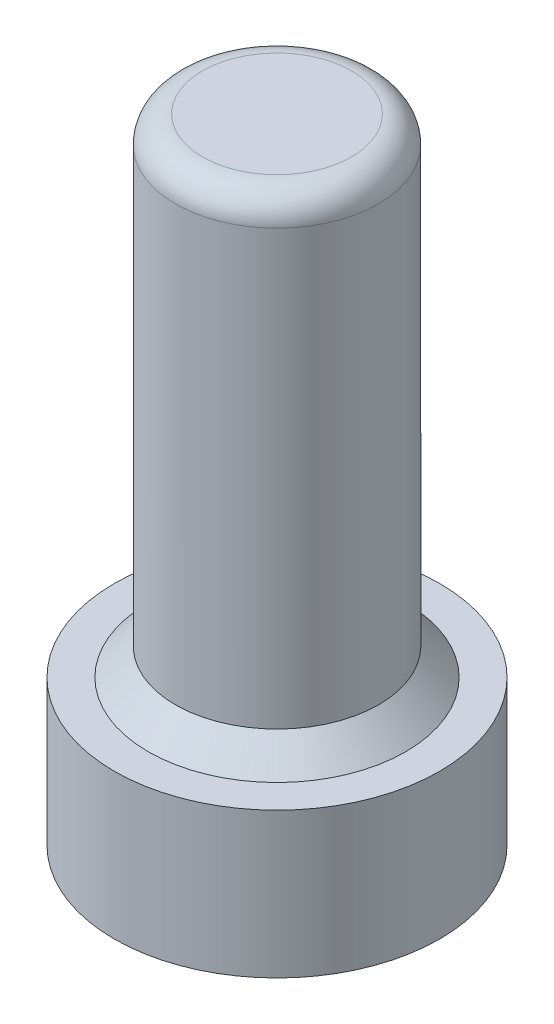
ISO-10303-21;
HEADER;
FILE_DESCRIPTION(('STEP AP214'),'2;1');
FILE_NAME('part.step','',(''),(''),'','','');
FILE_SCHEMA(('AUTOMOTIVE_DESIGN { 1 0 10303 214 1 1 1 1 }'));
ENDSEC;
DATA;
#1=APPLICATION_CONTEXT('core data for automotive mechanical design processes');
#2=APPLICATION_PROTOCOL_DEFINITION('international standard','automotive_design',2000,#1);
#3=PRODUCT_CONTEXT('',#1,'mechanical');
#4=PRODUCT('Part','Part','',(#3));
#5=PRODUCT_RELATED_PRODUCT_CATEGORY('part','',(#4));
#6=PRODUCT_DEFINITION_FORMATION('','',#4);
#7=PRODUCT_DEFINITION_CONTEXT('part definition',#1,'design');
#8=PRODUCT_DEFINITION('design','',#6,#7);
#9=PRODUCT_DEFINITION_SHAPE('','',#8);
#10=(LENGTH_UNIT() NAMED_UNIT(*) SI_UNIT(.MILLI.,.METRE.));
#11=(NAMED_UNIT(*) PLANE_ANGLE_UNIT() SI_UNIT($,.RADIAN.));
#12=(NAMED_UNIT(*) SI_UNIT($,.STERADIAN.) SOLID_ANGLE_UNIT());
#13=UNCERTAINTY_MEASURE_WITH_UNIT(LENGTH_MEASURE(1.E-05),#10,'distance_accuracy_value','');
#14=(GEOMETRIC_REPRESENTATION_CONTEXT(3) GLOBAL_UNCERTAINTY_ASSIGNED_CONTEXT((#13)) GLOBAL_UNIT_ASSIGNED_CONTEXT((#10,
#11,#12)) REPRESENTATION_CONTEXT('',''));
#15=CARTESIAN_POINT('',(0.,0.,0.));
#16=DIRECTION('',(0.,0.,1.));
#17=DIRECTION('',(1.,0.,0.));
#18=AXIS2_PLACEMENT_3D('',#15,#16,#17);
#19=CARTESIAN_POINT('',(0.,11.68,0.));
#20=DIRECTION('',(0.,1.,0.));
#21=DIRECTION('',(-1.,0.,0.));
#22=AXIS2_PLACEMENT_3D('',#19,#20,#21);
#23=PLANE('',#22);
#24=CARTESIAN_POINT('',(0.,11.68,0.));
#25=DIRECTION('',(0.,1.,0.));
#26=DIRECTION('',(-1.,0.,0.));
#27=AXIS2_PLACEMENT_3D('',#24,#25,#26);
#28=CIRCLE('',#27,1.37500000000003);
#29=CARTESIAN_POINT('',(-1.37500000000007,11.68,0.));
#30=VERTEX_POINT('',#29);
#31=EDGE_CURVE('E10',#30,#30,#28,.T.);
#32=ORIENTED_EDGE('',*,*,#31,.T.);
#33=EDGE_LOOP('',(#32));
#34=FACE_BOUND('',#33,.T.);
#35=ADVANCED_FACE('F31',(#34),#23,.T.);
#36=CARTESIAN_POINT('',(3.49148133884313E-12,-1000.,0.));
#37=DIRECTION('',(0.,-1.,0.));
#38=DIRECTION('',(1.,0.,0.));
#39=AXIS2_PLACEMENT_3D('',#36,#37,#38);
#40=CYLINDRICAL_SURFACE('',#39,1.87500000000003);
#41=CARTESIAN_POINT('',(0.,11.18,0.));
#42=DIRECTION('',(0.,1.,0.));
#43=DIRECTION('',(-1.,0.,0.));
#44=AXIS2_PLACEMENT_3D('',#41,#42,#43);
#45=CIRCLE('',#44,1.87500000000003);
#46=CARTESIAN_POINT('',(-1.87500000000007,11.18,0.));
#47=VERTEX_POINT('',#46);
#48=EDGE_CURVE('E38',#47,#47,#45,.F.);
#49=ORIENTED_EDGE('',*,*,#48,.T.);
#50=EDGE_LOOP('',(#49));
#51=FACE_BOUND('',#50,.T.);
#52=CARTESIAN_POINT('',(0.,3.17999999999996,0.));
#53=DIRECTION('',(0.,-1.,0.));
#54=DIRECTION('',(1.,0.,0.));
#55=AXIS2_PLACEMENT_3D('',#52,#53,#54);
#56=CIRCLE('',#55,1.87500000000001);
#57=CARTESIAN_POINT('',(1.875,3.17999999999997,0.));
#58=VERTEX_POINT('',#57);
#59=EDGE_CURVE('E42',#58,#58,#56,.T.);
#60=ORIENTED_EDGE('',*,*,#59,.F.);
#61=EDGE_LOOP('',(#60));
#62=FACE_BOUND('',#61,.T.);
#63=ADVANCED_FACE('F74',(#51,#62),#40,.T.);
#64=CARTESIAN_POINT('',(0.,2.68000000000002,0.));
#65=DIRECTION('',(0.,-1.,0.));
#66=DIRECTION('',(1.,0.,0.));
#67=AXIS2_PLACEMENT_3D('',#64,#65,#66);
#68=CONICAL_SURFACE('',#67,2.37500000000001,0.785398163397502);
#69=ORIENTED_EDGE('',*,*,#59,.T.);
#70=EDGE_LOOP('',(#69));
#71=FACE_BOUND('',#70,.T.);
#72=CARTESIAN_POINT('',(0.,2.68000000000002,0.));
#73=DIRECTION('',(0.,-1.,0.));
#74=DIRECTION('',(1.,0.,0.));
#75=AXIS2_PLACEMENT_3D('',#72,#73,#74);
#76=CIRCLE('',#75,2.37500000000001);
#77=CARTESIAN_POINT('',(2.375,2.68000000000002,0.));
#78=VERTEX_POINT('',#77);
#79=EDGE_CURVE('E46',#78,#78,#76,.T.);
#80=ORIENTED_EDGE('',*,*,#79,.F.);
#81=EDGE_LOOP('',(#80));
#82=FACE_BOUND('',#81,.T.);
#83=ADVANCED_FACE('F70',(#71,#82),#68,.T.);
#84=CARTESIAN_POINT('',(2.375,2.68,0.));
#85=DIRECTION('',(0.,1.,0.));
#86=DIRECTION('',(-1.,0.,0.));
#87=AXIS2_PLACEMENT_3D('',#84,#85,#86);
#88=PLANE('',#87);
#89=ORIENTED_EDGE('',*,*,#79,.T.);
#90=EDGE_LOOP('',(#89));
#91=FACE_BOUND('',#90,.T.);
#92=CARTESIAN_POINT('',(0.,2.68000000000002,0.));
#93=DIRECTION('',(0.,-1.,0.));
#94=DIRECTION('',(1.,0.,0.));
#95=AXIS2_PLACEMENT_3D('',#92,#93,#94);
#96=CIRCLE('',#95,3.00000000000001);
#97=CARTESIAN_POINT('',(3.,2.68000000000003,0.));
#98=VERTEX_POINT('',#97);
#99=EDGE_CURVE('E51',#98,#98,#96,.T.);
#100=ORIENTED_EDGE('',*,*,#99,.F.);
#101=EDGE_LOOP('',(#100));
#102=FACE_BOUND('',#101,.T.);
#103=ADVANCED_FACE('F62',(#91,#102),#88,.T.);
#104=CARTESIAN_POINT('',(3.49148133884313E-12,-1000.,0.));
#105=DIRECTION('',(0.,-1.,0.));
#106=DIRECTION('',(1.,0.,0.));
#107=AXIS2_PLACEMENT_3D('',#104,#105,#106);
#108=CYLINDRICAL_SURFACE('',#107,3.);
#109=ORIENTED_EDGE('',*,*,#99,.T.);
#110=EDGE_LOOP('',(#109));
#111=FACE_BOUND('',#110,.T.);
#112=CARTESIAN_POINT('',(0.,0.,0.));
#113=DIRECTION('',(0.,-1.,0.));
#114=DIRECTION('',(1.,0.,0.));
#115=AXIS2_PLACEMENT_3D('',#112,#113,#114);
#116=CIRCLE('',#115,3.);
#117=CARTESIAN_POINT('',(3.,0.,0.));
#118=VERTEX_POINT('',#117);
#119=EDGE_CURVE('E54',#118,#118,#116,.T.);
#120=ORIENTED_EDGE('',*,*,#119,.F.);
#121=EDGE_LOOP('',(#120));
#122=FACE_BOUND('',#121,.T.);
#123=ADVANCED_FACE('F60',(#111,#122),#108,.T.);
#124=CARTESIAN_POINT('',(3.,0.,0.));
#125=DIRECTION('',(0.,-1.,0.));
#126=DIRECTION('',(1.,0.,0.));
#127=AXIS2_PLACEMENT_3D('',#124,#125,#126);
#128=PLANE('',#127);
#129=ORIENTED_EDGE('',*,*,#119,.T.);
#130=EDGE_LOOP('',(#129));
#131=FACE_BOUND('',#130,.T.);
#132=ADVANCED_FACE('F58',(#131),#128,.T.);
#133=CARTESIAN_POINT('',(0.,11.18,0.));
#134=DIRECTION('',(0.,1.,0.));
#135=DIRECTION('',(-1.,0.,0.));
#136=AXIS2_PLACEMENT_3D('',#133,#134,#135);
#137=TOROIDAL_SURFACE('',#136,1.37500000000003,0.5);
#138=ORIENTED_EDGE('',*,*,#31,.F.);
#139=EDGE_LOOP('',(#138));
#140=FACE_BOUND('',#139,.T.);
#141=ORIENTED_EDGE('',*,*,#48,.F.);
#142=EDGE_LOOP('',(#141));
#143=FACE_BOUND('',#142,.T.);
#144=ADVANCED_FACE('F33',(#140,#143),#137,.T.);
#145=CLOSED_SHELL('',(#35,#63,#83,#103,#123,#132,#144));
#146=MANIFOLD_SOLID_BREP('B2',#145);
#147=ADVANCED_BREP_SHAPE_REPRESENTATION('',(#18,#146),#14);
#148=SHAPE_DEFINITION_REPRESENTATION(#9,#147);
ENDSEC;
END-ISO-10303-21;
